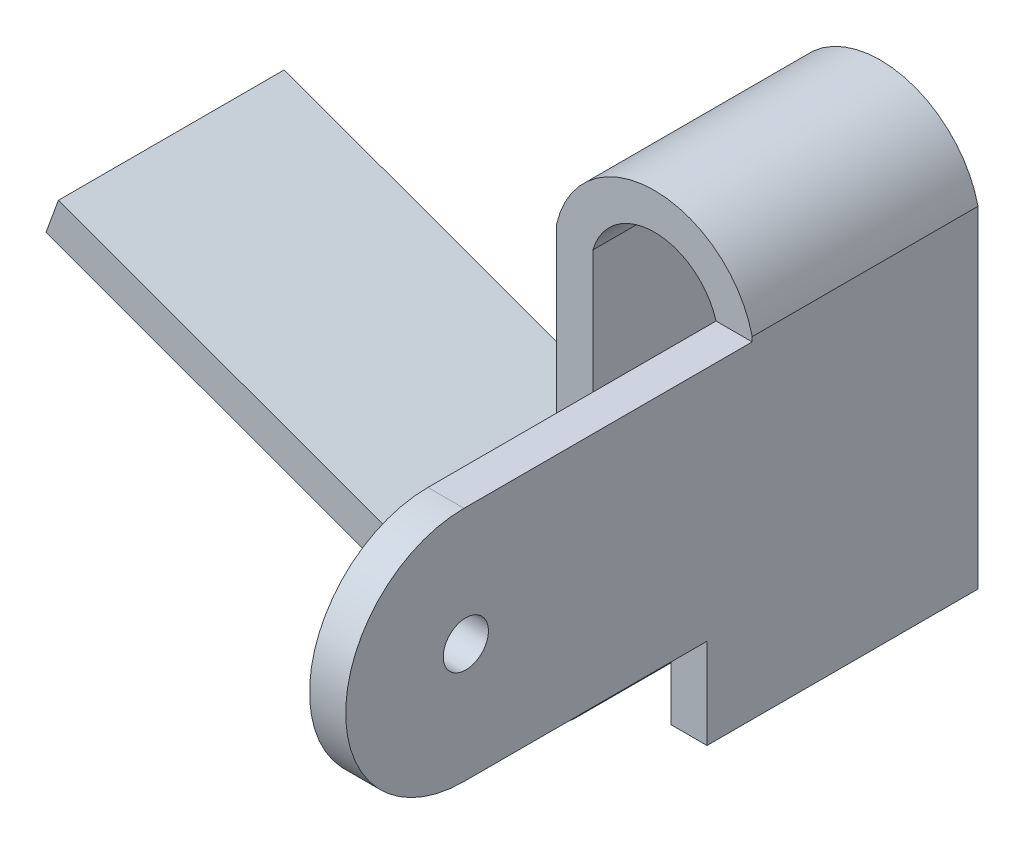
ISO-10303-21;
HEADER;
FILE_DESCRIPTION(('STEP AP214'),'2;1');
FILE_NAME('part.step','',(''),(''),'','','');
FILE_SCHEMA(('AUTOMOTIVE_DESIGN { 1 0 10303 214 1 1 1 1 }'));
ENDSEC;
DATA;
#1=APPLICATION_CONTEXT('core data for automotive mechanical design processes');
#2=APPLICATION_PROTOCOL_DEFINITION('international standard','automotive_design',2000,#1);
#3=PRODUCT_CONTEXT('',#1,'mechanical');
#4=PRODUCT('Part','Part','',(#3));
#5=PRODUCT_RELATED_PRODUCT_CATEGORY('part','',(#4));
#6=PRODUCT_DEFINITION_FORMATION('','',#4);
#7=PRODUCT_DEFINITION_CONTEXT('part definition',#1,'design');
#8=PRODUCT_DEFINITION('design','',#6,#7);
#9=PRODUCT_DEFINITION_SHAPE('','',#8);
#10=(LENGTH_UNIT() NAMED_UNIT(*) SI_UNIT(.MILLI.,.METRE.));
#11=(NAMED_UNIT(*) PLANE_ANGLE_UNIT() SI_UNIT($,.RADIAN.));
#12=(NAMED_UNIT(*) SI_UNIT($,.STERADIAN.) SOLID_ANGLE_UNIT());
#13=UNCERTAINTY_MEASURE_WITH_UNIT(LENGTH_MEASURE(1.E-05),#10,'distance_accuracy_value','');
#14=(GEOMETRIC_REPRESENTATION_CONTEXT(3) GLOBAL_UNCERTAINTY_ASSIGNED_CONTEXT((#13)) GLOBAL_UNIT_ASSIGNED_CONTEXT((#10,
#11,#12)) REPRESENTATION_CONTEXT('',''));
#15=CARTESIAN_POINT('',(0.,0.,0.));
#16=DIRECTION('',(0.,0.,1.));
#17=DIRECTION('',(1.,0.,0.));
#18=AXIS2_PLACEMENT_3D('',#15,#16,#17);
#19=CARTESIAN_POINT('',(-0.4,2.30976663071858,4.44023336928142));
#20=DIRECTION('',(-1.,0.,0.));
#21=DIRECTION('',(0.,0.,1.));
#22=AXIS2_PLACEMENT_3D('',#19,#20,#21);
#23=CYLINDRICAL_SURFACE('',#22,1.30976663071858);
#24=DIRECTION('',(1.,0.,0.));
#25=VECTOR('',#24,1.);
#26=CARTESIAN_POINT('',(-0.4,3.61953326143716,4.44023336928142));
#27=LINE('',#26,#25);
#28=CARTESIAN_POINT('',(-0.4,3.61953326143716,4.44023336928142));
#29=VERTEX_POINT('',#28);
#30=CARTESIAN_POINT('',(0.,3.61953326143716,4.44023336928142));
#31=VERTEX_POINT('',#30);
#32=EDGE_CURVE('E168',#29,#31,#27,.T.);
#33=ORIENTED_EDGE('',*,*,#32,.F.);
#34=CARTESIAN_POINT('',(-0.4,2.30976663071858,4.44023336928142));
#35=DIRECTION('',(1.,0.,0.));
#36=DIRECTION('',(0.,1.,0.));
#37=AXIS2_PLACEMENT_3D('',#34,#35,#36);
#38=CIRCLE('',#37,1.30976663071858);
#39=CARTESIAN_POINT('',(-0.4,1.,4.44023336928142));
#40=VERTEX_POINT('',#39);
#41=EDGE_CURVE('E43',#40,#29,#38,.F.);
#42=ORIENTED_EDGE('',*,*,#41,.F.);
#43=DIRECTION('',(1.,0.,0.));
#44=VECTOR('',#43,1.);
#45=CARTESIAN_POINT('',(-0.4,1.,4.44023336928142));
#46=LINE('',#45,#44);
#47=CARTESIAN_POINT('',(0.,1.,4.44023336928142));
#48=VERTEX_POINT('',#47);
#49=EDGE_CURVE('E180',#48,#40,#46,.F.);
#50=ORIENTED_EDGE('',*,*,#49,.F.);
#51=CARTESIAN_POINT('',(0.,2.30976663071858,4.44023336928142));
#52=DIRECTION('',(-1.,0.,0.));
#53=DIRECTION('',(0.,0.,1.));
#54=AXIS2_PLACEMENT_3D('',#51,#52,#53);
#55=CIRCLE('',#54,1.30976663071858);
#56=EDGE_CURVE('E11',#31,#48,#55,.F.);
#57=ORIENTED_EDGE('',*,*,#56,.F.);
#58=EDGE_LOOP('',(#33,#42,#50,#57));
#59=FACE_BOUND('',#58,.T.);
#60=ADVANCED_FACE('F35',(#59),#23,.T.);
#61=CARTESIAN_POINT('',(-0.4,0.,1.25));
#62=DIRECTION('',(0.,1.,0.));
#63=DIRECTION('',(0.,0.,1.));
#64=AXIS2_PLACEMENT_3D('',#61,#62,#63);
#65=PLANE('',#64);
#66=DIRECTION('',(0.,0.,-1.));
#67=VECTOR('',#66,1.);
#68=CARTESIAN_POINT('',(0.,0.,1.25));
#69=LINE('',#68,#67);
#70=CARTESIAN_POINT('',(0.,0.,1.75));
#71=VERTEX_POINT('',#70);
#72=CARTESIAN_POINT('',(0.,0.,-1.25));
#73=VERTEX_POINT('',#72);
#74=EDGE_CURVE('E157',#71,#73,#69,.T.);
#75=ORIENTED_EDGE('',*,*,#74,.F.);
#76=DIRECTION('',(1.,0.,0.));
#77=VECTOR('',#76,1.);
#78=CARTESIAN_POINT('',(-4.5,0.,1.75));
#79=LINE('',#78,#77);
#80=CARTESIAN_POINT('',(-0.4,0.,1.75));
#81=VERTEX_POINT('',#80);
#82=EDGE_CURVE('E143',#81,#71,#79,.T.);
#83=ORIENTED_EDGE('',*,*,#82,.F.);
#84=DIRECTION('',(0.,0.,-1.));
#85=VECTOR('',#84,1.);
#86=CARTESIAN_POINT('',(-0.4,0.,1.25));
#87=LINE('',#86,#85);
#88=CARTESIAN_POINT('',(-0.4,0.,-1.25));
#89=VERTEX_POINT('',#88);
#90=EDGE_CURVE('E222',#81,#89,#87,.T.);
#91=ORIENTED_EDGE('',*,*,#90,.T.);
#92=DIRECTION('',(1.,0.,0.));
#93=VECTOR('',#92,1.);
#94=CARTESIAN_POINT('',(-0.4,0.,-1.25));
#95=LINE('',#94,#93);
#96=EDGE_CURVE('E165',#89,#73,#95,.T.);
#97=ORIENTED_EDGE('',*,*,#96,.T.);
#98=EDGE_LOOP('',(#75,#83,#91,#97));
#99=FACE_BOUND('',#98,.T.);
#100=ADVANCED_FACE('F163',(#99),#65,.F.);
#101=CARTESIAN_POINT('',(0.,0.,1.25));
#102=DIRECTION('',(-1.,0.,0.));
#103=DIRECTION('',(0.,0.,1.));
#104=AXIS2_PLACEMENT_3D('',#101,#102,#103);
#105=PLANE('',#104);
#106=CARTESIAN_POINT('',(0.,2.30976663071858,4.42));
#107=DIRECTION('',(1.,0.,0.));
#108=DIRECTION('',(0.,0.,-1.));
#109=AXIS2_PLACEMENT_3D('',#106,#107,#108);
#110=CIRCLE('',#109,0.25);
#111=CARTESIAN_POINT('',(0.,2.30976663071858,4.17));
#112=VERTEX_POINT('',#111);
#113=EDGE_CURVE('E177',#112,#112,#110,.T.);
#114=ORIENTED_EDGE('',*,*,#113,.F.);
#115=EDGE_LOOP('',(#114));
#116=FACE_BOUND('',#115,.T.);
#117=DIRECTION('',(0.,0.,-1.));
#118=VECTOR('',#117,1.);
#119=CARTESIAN_POINT('',(0.,3.61953326143716,5.75));
#120=LINE('',#119,#118);
#121=CARTESIAN_POINT('',(0.,3.61953326143716,1.25));
#122=VERTEX_POINT('',#121);
#123=EDGE_CURVE('E194',#31,#122,#120,.T.);
#124=ORIENTED_EDGE('',*,*,#123,.F.);
#125=ORIENTED_EDGE('',*,*,#56,.T.);
#126=DIRECTION('',(0.,0.,1.));
#127=VECTOR('',#126,1.);
#128=CARTESIAN_POINT('',(0.,1.,5.75));
#129=LINE('',#128,#127);
#130=CARTESIAN_POINT('',(0.,1.,1.75));
#131=VERTEX_POINT('',#130);
#132=EDGE_CURVE('E154',#131,#48,#129,.T.);
#133=ORIENTED_EDGE('',*,*,#132,.F.);
#134=DIRECTION('',(0.,1.,0.));
#135=VECTOR('',#134,1.);
#136=CARTESIAN_POINT('',(0.,0.,1.75));
#137=LINE('',#136,#135);
#138=EDGE_CURVE('E147',#71,#131,#137,.T.);
#139=ORIENTED_EDGE('',*,*,#138,.F.);
#140=ORIENTED_EDGE('',*,*,#74,.T.);
#141=DIRECTION('',(0.,1.,0.));
#142=VECTOR('',#141,1.);
#143=CARTESIAN_POINT('',(0.,0.,-1.25));
#144=LINE('',#143,#142);
#145=CARTESIAN_POINT('',(0.,3.67,-1.25));
#146=VERTEX_POINT('',#145);
#147=EDGE_CURVE('E224',#73,#146,#144,.T.);
#148=ORIENTED_EDGE('',*,*,#147,.T.);
#149=DIRECTION('',(0.,0.,-1.));
#150=VECTOR('',#149,1.);
#151=CARTESIAN_POINT('',(0.,3.67,1.25));
#152=LINE('',#151,#150);
#153=CARTESIAN_POINT('',(0.,3.67,1.25));
#154=VERTEX_POINT('',#153);
#155=EDGE_CURVE('E166',#154,#146,#152,.T.);
#156=ORIENTED_EDGE('',*,*,#155,.F.);
#157=DIRECTION('',(0.,1.,0.));
#158=VECTOR('',#157,1.);
#159=CARTESIAN_POINT('',(0.,0.,1.25));
#160=LINE('',#159,#158);
#161=EDGE_CURVE('E200',#122,#154,#160,.T.);
#162=ORIENTED_EDGE('',*,*,#161,.F.);
#163=EDGE_LOOP('',(#124,#125,#133,#139,#140,#148,#156,#162));
#164=FACE_BOUND('',#163,.T.);
#165=ADVANCED_FACE('F156',(#116,#164),#105,.F.);
#166=CARTESIAN_POINT('',(-1.08183729029083,3.42154864191115,1.25));
#167=DIRECTION('',(0.,0.,-1.));
#168=DIRECTION('',(-1.,0.,0.));
#169=AXIS2_PLACEMENT_3D('',#166,#167,#168);
#170=CYLINDRICAL_SURFACE('',#169,1.11);
#171=CARTESIAN_POINT('',(-1.08183729029083,3.42154864191115,-1.25));
#172=DIRECTION('',(0.,0.,1.));
#173=DIRECTION('',(1.,0.,0.));
#174=AXIS2_PLACEMENT_3D('',#171,#172,#173);
#175=CIRCLE('',#174,1.11);
#176=CARTESIAN_POINT('',(-2.16367458058166,3.67,-1.25));
#177=VERTEX_POINT('',#176);
#178=EDGE_CURVE('E226',#146,#177,#175,.T.);
#179=ORIENTED_EDGE('',*,*,#178,.T.);
#180=DIRECTION('',(0.,0.,-1.));
#181=VECTOR('',#180,1.);
#182=CARTESIAN_POINT('',(-2.16367458058166,3.67,1.25));
#183=LINE('',#182,#181);
#184=CARTESIAN_POINT('',(-2.16367458058166,3.67,1.25));
#185=VERTEX_POINT('',#184);
#186=EDGE_CURVE('E171',#185,#177,#183,.T.);
#187=ORIENTED_EDGE('',*,*,#186,.F.);
#188=CARTESIAN_POINT('',(-1.08183729029083,3.42154864191115,1.25));
#189=DIRECTION('',(0.,0.,1.));
#190=DIRECTION('',(1.,0.,0.));
#191=AXIS2_PLACEMENT_3D('',#188,#189,#190);
#192=CIRCLE('',#191,1.11);
#193=EDGE_CURVE('E202',#154,#185,#192,.T.);
#194=ORIENTED_EDGE('',*,*,#193,.F.);
#195=ORIENTED_EDGE('',*,*,#155,.T.);
#196=EDGE_LOOP('',(#179,#187,#194,#195));
#197=FACE_BOUND('',#196,.T.);
#198=ADVANCED_FACE('F298',(#197),#170,.T.);
#199=CARTESIAN_POINT('',(-2.16367458058166,3.67,1.25));
#200=DIRECTION('',(1.,0.,0.));
#201=DIRECTION('',(0.,1.,0.));
#202=AXIS2_PLACEMENT_3D('',#199,#200,#201);
#203=PLANE('',#202);
#204=DIRECTION('',(0.,-1.,0.));
#205=VECTOR('',#204,1.);
#206=CARTESIAN_POINT('',(-2.16367458058166,3.67,-1.25));
#207=LINE('',#206,#205);
#208=CARTESIAN_POINT('',(-2.16367458058166,-0.5,-1.25));
#209=VERTEX_POINT('',#208);
#210=EDGE_CURVE('E228',#177,#209,#207,.T.);
#211=ORIENTED_EDGE('',*,*,#210,.T.);
#212=DIRECTION('',(0.,0.,-1.));
#213=VECTOR('',#212,1.);
#214=CARTESIAN_POINT('',(-2.16367458058166,-0.5,1.25));
#215=LINE('',#214,#213);
#216=CARTESIAN_POINT('',(-2.16367458058166,-0.5,1.25));
#217=VERTEX_POINT('',#216);
#218=EDGE_CURVE('E267',#217,#209,#215,.T.);
#219=ORIENTED_EDGE('',*,*,#218,.F.);
#220=DIRECTION('',(0.,-1.,0.));
#221=VECTOR('',#220,1.);
#222=CARTESIAN_POINT('',(-2.16367458058166,3.67,1.25));
#223=LINE('',#222,#221);
#224=EDGE_CURVE('E205',#185,#217,#223,.T.);
#225=ORIENTED_EDGE('',*,*,#224,.F.);
#226=ORIENTED_EDGE('',*,*,#186,.T.);
#227=EDGE_LOOP('',(#211,#219,#225,#226));
#228=FACE_BOUND('',#227,.T.);
#229=ADVANCED_FACE('F274',(#228),#203,.F.);
#230=CARTESIAN_POINT('',(-2.42367458058166,-0.5,1.25));
#231=DIRECTION('',(0.,0.,-1.));
#232=DIRECTION('',(-1.,0.,0.));
#233=AXIS2_PLACEMENT_3D('',#230,#231,#232);
#234=CYLINDRICAL_SURFACE('',#233,0.26);
#235=CARTESIAN_POINT('',(-2.42367458058166,-0.5,-1.25));
#236=DIRECTION('',(0.,0.,-1.));
#237=DIRECTION('',(-1.,0.,0.));
#238=AXIS2_PLACEMENT_3D('',#235,#236,#237);
#239=CIRCLE('',#238,0.26);
#240=CARTESIAN_POINT('',(-2.51259981784633,-0.744320081404335,-1.25));
#241=VERTEX_POINT('',#240);
#242=EDGE_CURVE('E230',#209,#241,#239,.T.);
#243=ORIENTED_EDGE('',*,*,#242,.T.);
#244=DIRECTION('',(0.,0.,-1.));
#245=VECTOR('',#244,1.);
#246=CARTESIAN_POINT('',(-2.51259981784633,-0.744320081404335,1.25));
#247=LINE('',#246,#245);
#248=CARTESIAN_POINT('',(-2.51259981784633,-0.744320081404335,1.25));
#249=VERTEX_POINT('',#248);
#250=EDGE_CURVE('E264',#249,#241,#247,.T.);
#251=ORIENTED_EDGE('',*,*,#250,.F.);
#252=CARTESIAN_POINT('',(-2.42367458058166,-0.5,1.25));
#253=DIRECTION('',(0.,0.,-1.));
#254=DIRECTION('',(-1.,0.,0.));
#255=AXIS2_PLACEMENT_3D('',#252,#253,#254);
#256=CIRCLE('',#255,0.26);
#257=EDGE_CURVE('E207',#217,#249,#256,.T.);
#258=ORIENTED_EDGE('',*,*,#257,.F.);
#259=ORIENTED_EDGE('',*,*,#218,.T.);
#260=EDGE_LOOP('',(#243,#251,#258,#259));
#261=FACE_BOUND('',#260,.T.);
#262=ADVANCED_FACE('F286',(#261),#234,.F.);
#263=CARTESIAN_POINT('',(-2.51259981784633,-0.744320081404335,1.25));
#264=DIRECTION('',(-0.342020143325673,-0.939692620785907,0.));
#265=DIRECTION('',(0.939692620785907,-0.342020143325673,0.));
#266=AXIS2_PLACEMENT_3D('',#263,#264,#265);
#267=PLANE('',#266);
#268=DIRECTION('',(-0.939692620785907,0.342020143325673,0.));
#269=VECTOR('',#268,1.);
#270=CARTESIAN_POINT('',(-2.51259981784633,-0.744320081404335,-1.25));
#271=LINE('',#270,#269);
#272=CARTESIAN_POINT('',(-7.68090923216882,1.13679070688686,-1.25));
#273=VERTEX_POINT('',#272);
#274=EDGE_CURVE('E232',#241,#273,#271,.T.);
#275=ORIENTED_EDGE('',*,*,#274,.T.);
#276=DIRECTION('',(0.,0.,-1.));
#277=VECTOR('',#276,1.);
#278=CARTESIAN_POINT('',(-7.68090923216882,1.13679070688686,1.25));
#279=LINE('',#278,#277);
#280=CARTESIAN_POINT('',(-7.68090923216882,1.13679070688686,1.25));
#281=VERTEX_POINT('',#280);
#282=EDGE_CURVE('E261',#281,#273,#279,.T.);
#283=ORIENTED_EDGE('',*,*,#282,.F.);
#284=DIRECTION('',(-0.939692620785907,0.342020143325673,0.));
#285=VECTOR('',#284,1.);
#286=CARTESIAN_POINT('',(-2.51259981784633,-0.744320081404335,1.25));
#287=LINE('',#286,#285);
#288=EDGE_CURVE('E209',#249,#281,#287,.T.);
#289=ORIENTED_EDGE('',*,*,#288,.F.);
#290=ORIENTED_EDGE('',*,*,#250,.T.);
#291=EDGE_LOOP('',(#275,#283,#289,#290));
#292=FACE_BOUND('',#291,.T.);
#293=ADVANCED_FACE('F290',(#292),#267,.F.);
#294=CARTESIAN_POINT('',(-7.81771728949909,0.760913658572502,1.25));
#295=DIRECTION('',(0.939692620785907,-0.342020143325674,0.));
#296=DIRECTION('',(0.342020143325674,0.939692620785907,0.));
#297=AXIS2_PLACEMENT_3D('',#294,#295,#296);
#298=PLANE('',#297);
#299=DIRECTION('',(-0.342020143325674,-0.939692620785907,0.));
#300=VECTOR('',#299,1.);
#301=CARTESIAN_POINT('',(-7.81771728949909,0.760913658572502,-1.25));
#302=LINE('',#301,#300);
#303=CARTESIAN_POINT('',(-7.81771728949909,0.760913658572502,-1.25));
#304=VERTEX_POINT('',#303);
#305=EDGE_CURVE('E234',#273,#304,#302,.T.);
#306=ORIENTED_EDGE('',*,*,#305,.T.);
#307=DIRECTION('',(0.,0.,-1.));
#308=VECTOR('',#307,1.);
#309=CARTESIAN_POINT('',(-7.81771728949909,0.760913658572502,1.25));
#310=LINE('',#309,#308);
#311=CARTESIAN_POINT('',(-7.81771728949909,0.760913658572502,1.25));
#312=VERTEX_POINT('',#311);
#313=EDGE_CURVE('E258',#312,#304,#310,.T.);
#314=ORIENTED_EDGE('',*,*,#313,.F.);
#315=DIRECTION('',(-0.342020143325674,-0.939692620785907,0.));
#316=VECTOR('',#315,1.);
#317=CARTESIAN_POINT('',(-7.81771728949909,0.760913658572502,1.25));
#318=LINE('',#317,#316);
#319=EDGE_CURVE('E211',#281,#312,#318,.T.);
#320=ORIENTED_EDGE('',*,*,#319,.F.);
#321=ORIENTED_EDGE('',*,*,#282,.T.);
#322=EDGE_LOOP('',(#306,#314,#320,#321));
#323=FACE_BOUND('',#322,.T.);
#324=ADVANCED_FACE('F320',(#323),#298,.F.);
#325=CARTESIAN_POINT('',(-2.6494078751766,-1.1201971297187,1.25));
#326=DIRECTION('',(0.342020143325673,0.939692620785907,0.));
#327=DIRECTION('',(-0.939692620785907,0.342020143325673,0.));
#328=AXIS2_PLACEMENT_3D('',#325,#326,#327);
#329=PLANE('',#328);
#330=DIRECTION('',(0.939692620785907,-0.342020143325673,0.));
#331=VECTOR('',#330,1.);
#332=CARTESIAN_POINT('',(-2.6494078751766,-1.1201971297187,-1.25));
#333=LINE('',#332,#331);
#334=CARTESIAN_POINT('',(-2.6494078751766,-1.1201971297187,-1.25));
#335=VERTEX_POINT('',#334);
#336=EDGE_CURVE('E236',#304,#335,#333,.T.);
#337=ORIENTED_EDGE('',*,*,#336,.T.);
#338=DIRECTION('',(0.,0.,-1.));
#339=VECTOR('',#338,1.);
#340=CARTESIAN_POINT('',(-2.6494078751766,-1.1201971297187,1.25));
#341=LINE('',#340,#339);
#342=CARTESIAN_POINT('',(-2.6494078751766,-1.1201971297187,1.25));
#343=VERTEX_POINT('',#342);
#344=EDGE_CURVE('E255',#343,#335,#341,.T.);
#345=ORIENTED_EDGE('',*,*,#344,.F.);
#346=DIRECTION('',(0.939692620785907,-0.342020143325673,0.));
#347=VECTOR('',#346,1.);
#348=CARTESIAN_POINT('',(-2.6494078751766,-1.1201971297187,1.25));
#349=LINE('',#348,#347);
#350=EDGE_CURVE('E213',#312,#343,#349,.T.);
#351=ORIENTED_EDGE('',*,*,#350,.F.);
#352=ORIENTED_EDGE('',*,*,#313,.T.);
#353=EDGE_LOOP('',(#337,#345,#351,#352));
#354=FACE_BOUND('',#353,.T.);
#355=ADVANCED_FACE('F318',(#354),#329,.F.);
#356=CARTESIAN_POINT('',(-2.42367458058166,-0.5,1.25));
#357=DIRECTION('',(0.,0.,-1.));
#358=DIRECTION('',(-1.,0.,0.));
#359=AXIS2_PLACEMENT_3D('',#356,#357,#358);
#360=CYLINDRICAL_SURFACE('',#359,0.66);
#361=CARTESIAN_POINT('',(-2.42367458058166,-0.5,-1.25));
#362=DIRECTION('',(0.,0.,1.));
#363=DIRECTION('',(-1.,0.,0.));
#364=AXIS2_PLACEMENT_3D('',#361,#362,#363);
#365=CIRCLE('',#364,0.66);
#366=CARTESIAN_POINT('',(-1.76367458058166,-0.499999999999999,-1.25));
#367=VERTEX_POINT('',#366);
#368=EDGE_CURVE('E238',#335,#367,#365,.T.);
#369=ORIENTED_EDGE('',*,*,#368,.T.);
#370=DIRECTION('',(0.,0.,-1.));
#371=VECTOR('',#370,1.);
#372=CARTESIAN_POINT('',(-1.76367458058166,-0.499999999999999,1.25));
#373=LINE('',#372,#371);
#374=CARTESIAN_POINT('',(-1.76367458058166,-0.499999999999999,1.25));
#375=VERTEX_POINT('',#374);
#376=EDGE_CURVE('E252',#375,#367,#373,.T.);
#377=ORIENTED_EDGE('',*,*,#376,.F.);
#378=CARTESIAN_POINT('',(-2.42367458058166,-0.5,1.25));
#379=DIRECTION('',(0.,0.,1.));
#380=DIRECTION('',(-1.,0.,0.));
#381=AXIS2_PLACEMENT_3D('',#378,#379,#380);
#382=CIRCLE('',#381,0.66);
#383=EDGE_CURVE('E215',#343,#375,#382,.T.);
#384=ORIENTED_EDGE('',*,*,#383,.F.);
#385=ORIENTED_EDGE('',*,*,#344,.T.);
#386=EDGE_LOOP('',(#369,#377,#384,#385));
#387=FACE_BOUND('',#386,.T.);
#388=ADVANCED_FACE('F314',(#387),#360,.T.);
#389=CARTESIAN_POINT('',(-1.76367458058166,3.61953326143716,1.25));
#390=DIRECTION('',(-1.,0.,0.));
#391=DIRECTION('',(0.,0.,1.));
#392=AXIS2_PLACEMENT_3D('',#389,#390,#391);
#393=PLANE('',#392);
#394=DIRECTION('',(0.,1.,0.));
#395=VECTOR('',#394,1.);
#396=CARTESIAN_POINT('',(-1.76367458058166,3.61953326143716,-1.25));
#397=LINE('',#396,#395);
#398=CARTESIAN_POINT('',(-1.76367458058166,3.61953326143716,-1.25));
#399=VERTEX_POINT('',#398);
#400=EDGE_CURVE('E240',#367,#399,#397,.T.);
#401=ORIENTED_EDGE('',*,*,#400,.T.);
#402=DIRECTION('',(0.,0.,-1.));
#403=VECTOR('',#402,1.);
#404=CARTESIAN_POINT('',(-1.76367458058166,3.61953326143716,1.25));
#405=LINE('',#404,#403);
#406=CARTESIAN_POINT('',(-1.76367458058166,3.61953326143716,1.25));
#407=VERTEX_POINT('',#406);
#408=EDGE_CURVE('E249',#407,#399,#405,.T.);
#409=ORIENTED_EDGE('',*,*,#408,.F.);
#410=DIRECTION('',(0.,1.,0.));
#411=VECTOR('',#410,1.);
#412=CARTESIAN_POINT('',(-1.76367458058166,3.61953326143716,1.25));
#413=LINE('',#412,#411);
#414=EDGE_CURVE('E217',#375,#407,#413,.T.);
#415=ORIENTED_EDGE('',*,*,#414,.F.);
#416=ORIENTED_EDGE('',*,*,#376,.T.);
#417=EDGE_LOOP('',(#401,#409,#415,#416));
#418=FACE_BOUND('',#417,.T.);
#419=ADVANCED_FACE('F310',(#418),#393,.F.);
#420=CARTESIAN_POINT('',(-1.08183729029083,3.42154864191115,1.25));
#421=DIRECTION('',(0.,0.,-1.));
#422=DIRECTION('',(-1.,0.,0.));
#423=AXIS2_PLACEMENT_3D('',#420,#421,#422);
#424=CYLINDRICAL_SURFACE('',#423,0.71);
#425=CARTESIAN_POINT('',(-1.08183729029083,3.42154864191115,-1.25));
#426=DIRECTION('',(0.,0.,-1.));
#427=DIRECTION('',(1.,0.,0.));
#428=AXIS2_PLACEMENT_3D('',#425,#426,#427);
#429=CIRCLE('',#428,0.71);
#430=CARTESIAN_POINT('',(-0.4,3.61953326143716,-1.25));
#431=VERTEX_POINT('',#430);
#432=EDGE_CURVE('E242',#399,#431,#429,.T.);
#433=ORIENTED_EDGE('',*,*,#432,.T.);
#434=DIRECTION('',(0.,0.,-1.));
#435=VECTOR('',#434,1.);
#436=CARTESIAN_POINT('',(-0.4,3.61953326143716,1.25));
#437=LINE('',#436,#435);
#438=CARTESIAN_POINT('',(-0.4,3.61953326143716,1.25));
#439=VERTEX_POINT('',#438);
#440=EDGE_CURVE('E247',#439,#431,#437,.T.);
#441=ORIENTED_EDGE('',*,*,#440,.F.);
#442=CARTESIAN_POINT('',(-1.08183729029083,3.42154864191115,1.25));
#443=DIRECTION('',(0.,0.,-1.));
#444=DIRECTION('',(1.,0.,0.));
#445=AXIS2_PLACEMENT_3D('',#442,#443,#444);
#446=CIRCLE('',#445,0.71);
#447=EDGE_CURVE('E219',#407,#439,#446,.T.);
#448=ORIENTED_EDGE('',*,*,#447,.F.);
#449=ORIENTED_EDGE('',*,*,#408,.T.);
#450=EDGE_LOOP('',(#433,#441,#448,#449));
#451=FACE_BOUND('',#450,.T.);
#452=ADVANCED_FACE('F304',(#451),#424,.F.);
#453=CARTESIAN_POINT('',(-0.4,0.,1.25));
#454=DIRECTION('',(1.,0.,0.));
#455=DIRECTION('',(0.,1.,0.));
#456=AXIS2_PLACEMENT_3D('',#453,#454,#455);
#457=PLANE('',#456);
#458=CARTESIAN_POINT('',(-0.4,2.30976663071858,4.42));
#459=DIRECTION('',(1.,0.,0.));
#460=DIRECTION('',(0.,1.,0.));
#461=AXIS2_PLACEMENT_3D('',#458,#459,#460);
#462=CIRCLE('',#461,0.25);
#463=CARTESIAN_POINT('',(-0.4,2.55976663071858,4.42));
#464=VERTEX_POINT('',#463);
#465=EDGE_CURVE('E160',#464,#464,#462,.T.);
#466=ORIENTED_EDGE('',*,*,#465,.T.);
#467=EDGE_LOOP('',(#466));
#468=FACE_BOUND('',#467,.T.);
#469=DIRECTION('',(0.,0.,1.));
#470=VECTOR('',#469,1.);
#471=CARTESIAN_POINT('',(-0.4,1.,1.25));
#472=LINE('',#471,#470);
#473=CARTESIAN_POINT('',(-0.4,1.,1.75));
#474=VERTEX_POINT('',#473);
#475=EDGE_CURVE('E188',#474,#40,#472,.T.);
#476=ORIENTED_EDGE('',*,*,#475,.T.);
#477=ORIENTED_EDGE('',*,*,#41,.T.);
#478=DIRECTION('',(0.,0.,-1.));
#479=VECTOR('',#478,1.);
#480=CARTESIAN_POINT('',(-0.4,3.61953326143716,5.75));
#481=LINE('',#480,#479);
#482=EDGE_CURVE('E186',#29,#439,#481,.T.);
#483=ORIENTED_EDGE('',*,*,#482,.T.);
#484=ORIENTED_EDGE('',*,*,#440,.T.);
#485=DIRECTION('',(0.,-1.,0.));
#486=VECTOR('',#485,1.);
#487=CARTESIAN_POINT('',(-0.4,0.,-1.25));
#488=LINE('',#487,#486);
#489=EDGE_CURVE('E203',#431,#89,#488,.T.);
#490=ORIENTED_EDGE('',*,*,#489,.T.);
#491=ORIENTED_EDGE('',*,*,#90,.F.);
#492=DIRECTION('',(0.,1.,0.));
#493=VECTOR('',#492,1.);
#494=CARTESIAN_POINT('',(-0.4,0.,1.75));
#495=LINE('',#494,#493);
#496=EDGE_CURVE('E149',#81,#474,#495,.T.);
#497=ORIENTED_EDGE('',*,*,#496,.T.);
#498=EDGE_LOOP('',(#476,#477,#483,#484,#490,#491,#497));
#499=FACE_BOUND('',#498,.T.);
#500=ADVANCED_FACE('F183',(#468,#499),#457,.F.);
#501=CARTESIAN_POINT('',(-1.08183729029083,3.42154864191115,1.25));
#502=DIRECTION('',(0.,0.,1.));
#503=DIRECTION('',(1.,0.,0.));
#504=AXIS2_PLACEMENT_3D('',#501,#502,#503);
#505=PLANE('',#504);
#506=DIRECTION('',(-1.,0.,0.));
#507=VECTOR('',#506,1.);
#508=CARTESIAN_POINT('',(0.,3.61953326143716,1.25));
#509=LINE('',#508,#507);
#510=EDGE_CURVE('E193',#122,#439,#509,.T.);
#511=ORIENTED_EDGE('',*,*,#510,.F.);
#512=ORIENTED_EDGE('',*,*,#161,.T.);
#513=ORIENTED_EDGE('',*,*,#193,.T.);
#514=ORIENTED_EDGE('',*,*,#224,.T.);
#515=ORIENTED_EDGE('',*,*,#257,.T.);
#516=ORIENTED_EDGE('',*,*,#288,.T.);
#517=ORIENTED_EDGE('',*,*,#319,.T.);
#518=ORIENTED_EDGE('',*,*,#350,.T.);
#519=ORIENTED_EDGE('',*,*,#383,.T.);
#520=ORIENTED_EDGE('',*,*,#414,.T.);
#521=ORIENTED_EDGE('',*,*,#447,.T.);
#522=EDGE_LOOP('',(#511,#512,#513,#514,#515,#516,#517,#518,#519,#520,#521));
#523=FACE_BOUND('',#522,.T.);
#524=ADVANCED_FACE('F294',(#523),#505,.T.);
#525=CARTESIAN_POINT('',(-1.08183729029083,3.42154864191115,-1.25));
#526=DIRECTION('',(0.,0.,1.));
#527=DIRECTION('',(1.,0.,0.));
#528=AXIS2_PLACEMENT_3D('',#525,#526,#527);
#529=PLANE('',#528);
#530=ORIENTED_EDGE('',*,*,#96,.F.);
#531=ORIENTED_EDGE('',*,*,#489,.F.);
#532=ORIENTED_EDGE('',*,*,#432,.F.);
#533=ORIENTED_EDGE('',*,*,#400,.F.);
#534=ORIENTED_EDGE('',*,*,#368,.F.);
#535=ORIENTED_EDGE('',*,*,#336,.F.);
#536=ORIENTED_EDGE('',*,*,#305,.F.);
#537=ORIENTED_EDGE('',*,*,#274,.F.);
#538=ORIENTED_EDGE('',*,*,#242,.F.);
#539=ORIENTED_EDGE('',*,*,#210,.F.);
#540=ORIENTED_EDGE('',*,*,#178,.F.);
#541=ORIENTED_EDGE('',*,*,#147,.F.);
#542=EDGE_LOOP('',(#530,#531,#532,#533,#534,#535,#536,#537,#538,#539,#540,#541));
#543=FACE_BOUND('',#542,.T.);
#544=ADVANCED_FACE('F281',(#543),#529,.F.);
#545=CARTESIAN_POINT('',(0.,3.61953326143716,5.75));
#546=DIRECTION('',(0.,-1.,0.));
#547=DIRECTION('',(0.,0.,-1.));
#548=AXIS2_PLACEMENT_3D('',#545,#546,#547);
#549=PLANE('',#548);
#550=ORIENTED_EDGE('',*,*,#482,.F.);
#551=ORIENTED_EDGE('',*,*,#32,.T.);
#552=ORIENTED_EDGE('',*,*,#123,.T.);
#553=ORIENTED_EDGE('',*,*,#510,.T.);
#554=EDGE_LOOP('',(#550,#551,#552,#553));
#555=FACE_BOUND('',#554,.T.);
#556=ADVANCED_FACE('F191',(#555),#549,.F.);
#557=CARTESIAN_POINT('',(-4.5,0.,1.75));
#558=DIRECTION('',(0.,0.,-1.));
#559=DIRECTION('',(-1.,0.,0.));
#560=AXIS2_PLACEMENT_3D('',#557,#558,#559);
#561=PLANE('',#560);
#562=ORIENTED_EDGE('',*,*,#82,.T.);
#563=ORIENTED_EDGE('',*,*,#138,.T.);
#564=DIRECTION('',(1.,0.,0.));
#565=VECTOR('',#564,1.);
#566=CARTESIAN_POINT('',(-4.5,1.,1.75));
#567=LINE('',#566,#565);
#568=EDGE_CURVE('E153',#474,#131,#567,.T.);
#569=ORIENTED_EDGE('',*,*,#568,.F.);
#570=ORIENTED_EDGE('',*,*,#496,.F.);
#571=EDGE_LOOP('',(#562,#563,#569,#570));
#572=FACE_BOUND('',#571,.T.);
#573=ADVANCED_FACE('F145',(#572),#561,.F.);
#574=CARTESIAN_POINT('',(-4.5,1.,5.75));
#575=DIRECTION('',(0.,1.,0.));
#576=DIRECTION('',(0.,0.,1.));
#577=AXIS2_PLACEMENT_3D('',#574,#575,#576);
#578=PLANE('',#577);
#579=ORIENTED_EDGE('',*,*,#132,.T.);
#580=ORIENTED_EDGE('',*,*,#49,.T.);
#581=ORIENTED_EDGE('',*,*,#475,.F.);
#582=ORIENTED_EDGE('',*,*,#568,.T.);
#583=EDGE_LOOP('',(#579,#580,#581,#582));
#584=FACE_BOUND('',#583,.T.);
#585=ADVANCED_FACE('F420',(#584),#578,.F.);
#586=CARTESIAN_POINT('',(-4.5,2.30976663071858,4.42));
#587=DIRECTION('',(1.,0.,0.));
#588=DIRECTION('',(0.,0.,-1.));
#589=AXIS2_PLACEMENT_3D('',#586,#587,#588);
#590=CYLINDRICAL_SURFACE('',#589,0.25);
#591=ORIENTED_EDGE('',*,*,#113,.T.);
#592=EDGE_LOOP('',(#591));
#593=FACE_BOUND('',#592,.T.);
#594=ORIENTED_EDGE('',*,*,#465,.F.);
#595=EDGE_LOOP('',(#594));
#596=FACE_BOUND('',#595,.T.);
#597=ADVANCED_FACE('F428',(#593,#596),#590,.F.);
#598=CLOSED_SHELL('',(#60,#100,#165,#198,#229,#262,#293,#324,#355,#388,#419,#452,#500,#524,#544,
#556,#573,#585,#597));
#599=MANIFOLD_SOLID_BREP('B2',#598);
#600=ADVANCED_BREP_SHAPE_REPRESENTATION('',(#18,#599),#14);
#601=SHAPE_DEFINITION_REPRESENTATION(#9,#600);
ENDSEC;
END-ISO-10303-21;
